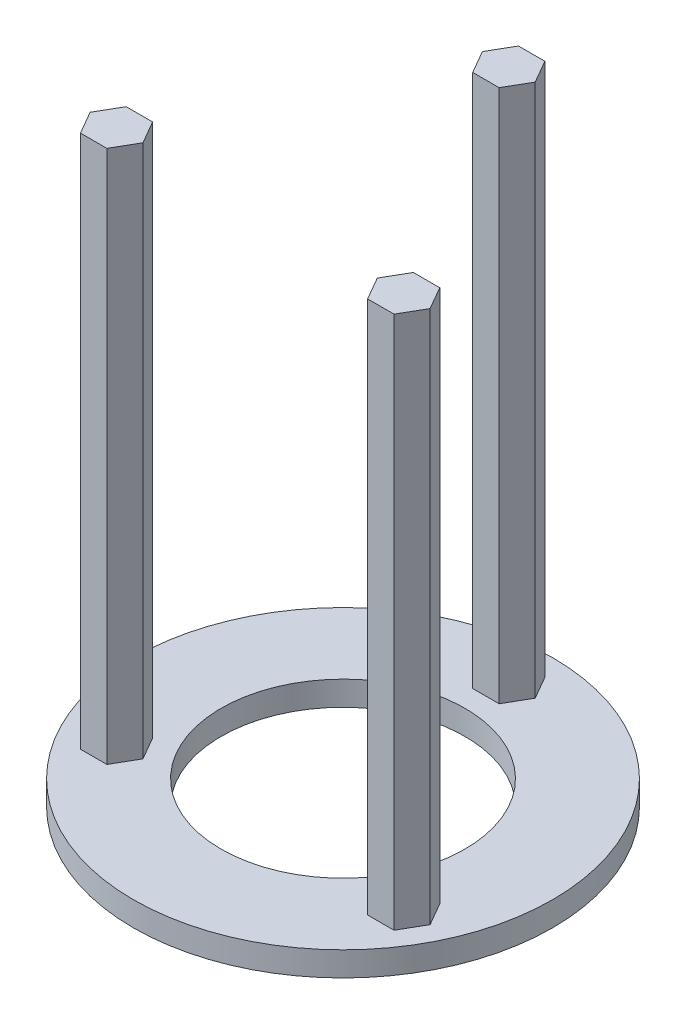
ISO-10303-21;
HEADER;
FILE_DESCRIPTION(('STEP AP214'),'2;1');
FILE_NAME('part.step','',(''),(''),'','','');
FILE_SCHEMA(('AUTOMOTIVE_DESIGN { 1 0 10303 214 1 1 1 1 }'));
ENDSEC;
DATA;
#1=APPLICATION_CONTEXT('core data for automotive mechanical design processes');
#2=APPLICATION_PROTOCOL_DEFINITION('international standard','automotive_design',2000,#1);
#3=PRODUCT_CONTEXT('',#1,'mechanical');
#4=PRODUCT('Part','Part','',(#3));
#5=PRODUCT_RELATED_PRODUCT_CATEGORY('part','',(#4));
#6=PRODUCT_DEFINITION_FORMATION('','',#4);
#7=PRODUCT_DEFINITION_CONTEXT('part definition',#1,'design');
#8=PRODUCT_DEFINITION('design','',#6,#7);
#9=PRODUCT_DEFINITION_SHAPE('','',#8);
#10=(LENGTH_UNIT() NAMED_UNIT(*) SI_UNIT(.MILLI.,.METRE.));
#11=(NAMED_UNIT(*) PLANE_ANGLE_UNIT() SI_UNIT($,.RADIAN.));
#12=(NAMED_UNIT(*) SI_UNIT($,.STERADIAN.) SOLID_ANGLE_UNIT());
#13=UNCERTAINTY_MEASURE_WITH_UNIT(LENGTH_MEASURE(1.E-05),#10,'distance_accuracy_value','');
#14=(GEOMETRIC_REPRESENTATION_CONTEXT(3) GLOBAL_UNCERTAINTY_ASSIGNED_CONTEXT((#13)) GLOBAL_UNIT_ASSIGNED_CONTEXT((#10,
#11,#12)) REPRESENTATION_CONTEXT('',''));
#15=CARTESIAN_POINT('',(0.,0.,0.));
#16=DIRECTION('',(0.,0.,1.));
#17=DIRECTION('',(1.,0.,0.));
#18=AXIS2_PLACEMENT_3D('',#15,#16,#17);
#19=CARTESIAN_POINT('',(0.,3.2,0.));
#20=DIRECTION('',(0.,1.,0.));
#21=DIRECTION('',(0.,0.,1.));
#22=AXIS2_PLACEMENT_3D('',#19,#20,#21);
#23=PLANE('',#22);
#24=CARTESIAN_POINT('',(0.,3.2,0.));
#25=DIRECTION('',(0.,1.,0.));
#26=DIRECTION('',(0.,0.,1.));
#27=AXIS2_PLACEMENT_3D('',#24,#25,#26);
#28=CIRCLE('',#27,27.5);
#29=CARTESIAN_POINT('',(0.,3.2,27.5));
#30=VERTEX_POINT('',#29);
#31=EDGE_CURVE('E11',#30,#30,#28,.T.);
#32=ORIENTED_EDGE('',*,*,#31,.T.);
#33=EDGE_LOOP('',(#32));
#34=FACE_BOUND('',#33,.T.);
#35=CARTESIAN_POINT('',(0.,3.2,0.));
#36=DIRECTION('',(0.,1.,0.));
#37=DIRECTION('',(0.,0.,1.));
#38=AXIS2_PLACEMENT_3D('',#35,#36,#37);
#39=CIRCLE('',#38,16.);
#40=CARTESIAN_POINT('',(0.,3.2,16.));
#41=VERTEX_POINT('',#40);
#42=EDGE_CURVE('E287',#41,#41,#39,.T.);
#43=ORIENTED_EDGE('',*,*,#42,.F.);
#44=EDGE_LOOP('',(#43));
#45=FACE_BOUND('',#44,.T.);
#46=DIRECTION('',(-0.5,0.,-0.866025403784439));
#47=VECTOR('',#46,1.);
#48=CARTESIAN_POINT('',(3.46410161513776,3.2,-21.75));
#49=LINE('',#48,#47);
#50=CARTESIAN_POINT('',(3.46410161513776,3.2,-21.75));
#51=VERTEX_POINT('',#50);
#52=CARTESIAN_POINT('',(1.73205080756888,3.2,-24.75));
#53=VERTEX_POINT('',#52);
#54=EDGE_CURVE('E261',#51,#53,#49,.T.);
#55=ORIENTED_EDGE('',*,*,#54,.F.);
#56=DIRECTION('',(0.5,0.,-0.866025403784439));
#57=VECTOR('',#56,1.);
#58=CARTESIAN_POINT('',(1.73205080756888,3.2,-18.75));
#59=LINE('',#58,#57);
#60=CARTESIAN_POINT('',(1.73205080756888,3.2,-18.75));
#61=VERTEX_POINT('',#60);
#62=EDGE_CURVE('E232',#61,#51,#59,.T.);
#63=ORIENTED_EDGE('',*,*,#62,.F.);
#64=DIRECTION('',(1.,0.,0.));
#65=VECTOR('',#64,1.);
#66=CARTESIAN_POINT('',(-1.73205080756888,3.2,-18.75));
#67=LINE('',#66,#65);
#68=CARTESIAN_POINT('',(-1.73205080756888,3.2,-18.75));
#69=VERTEX_POINT('',#68);
#70=EDGE_CURVE('E248',#69,#61,#67,.T.);
#71=ORIENTED_EDGE('',*,*,#70,.F.);
#72=DIRECTION('',(0.5,0.,0.866025403784439));
#73=VECTOR('',#72,1.);
#74=CARTESIAN_POINT('',(-3.46410161513775,3.2,-21.75));
#75=LINE('',#74,#73);
#76=CARTESIAN_POINT('',(-3.46410161513775,3.2,-21.75));
#77=VERTEX_POINT('',#76);
#78=EDGE_CURVE('E267',#77,#69,#75,.T.);
#79=ORIENTED_EDGE('',*,*,#78,.F.);
#80=DIRECTION('',(-0.5,0.,0.866025403784439));
#81=VECTOR('',#80,1.);
#82=CARTESIAN_POINT('',(-1.73205080756887,3.2,-24.75));
#83=LINE('',#82,#81);
#84=CARTESIAN_POINT('',(-1.73205080756887,3.2,-24.75));
#85=VERTEX_POINT('',#84);
#86=EDGE_CURVE('E265',#85,#77,#83,.T.);
#87=ORIENTED_EDGE('',*,*,#86,.F.);
#88=DIRECTION('',(-1.,0.,0.));
#89=VECTOR('',#88,1.);
#90=CARTESIAN_POINT('',(1.73205080756888,3.2,-24.75));
#91=LINE('',#90,#89);
#92=EDGE_CURVE('E263',#53,#85,#91,.T.);
#93=ORIENTED_EDGE('',*,*,#92,.F.);
#94=EDGE_LOOP('',(#55,#63,#71,#79,#87,#93));
#95=FACE_BOUND('',#94,.T.);
#96=DIRECTION('',(1.,0.,0.));
#97=VECTOR('',#96,1.);
#98=CARTESIAN_POINT('',(17.1040017247438,3.2,13.8749999999992));
#99=LINE('',#98,#97);
#100=CARTESIAN_POINT('',(17.1040017247438,3.2,13.8749999999992));
#101=VERTEX_POINT('',#100);
#102=CARTESIAN_POINT('',(20.5681033398816,3.2,13.8749999999992));
#103=VERTEX_POINT('',#102);
#104=EDGE_CURVE('E227',#101,#103,#99,.T.);
#105=ORIENTED_EDGE('',*,*,#104,.F.);
#106=DIRECTION('',(0.500000000000001,0.,0.866025403784438));
#107=VECTOR('',#106,1.);
#108=CARTESIAN_POINT('',(15.3719509171749,3.2,10.8749999999992));
#109=LINE('',#108,#107);
#110=CARTESIAN_POINT('',(15.3719509171749,3.2,10.8749999999992));
#111=VERTEX_POINT('',#110);
#112=EDGE_CURVE('E229',#111,#101,#109,.T.);
#113=ORIENTED_EDGE('',*,*,#112,.F.);
#114=DIRECTION('',(-0.500000000000002,0.,0.866025403784437));
#115=VECTOR('',#114,1.);
#116=CARTESIAN_POINT('',(17.1040017247438,3.2,7.87499999999923));
#117=LINE('',#116,#115);
#118=CARTESIAN_POINT('',(17.1040017247438,3.2,7.87499999999923));
#119=VERTEX_POINT('',#118);
#120=EDGE_CURVE('E218',#119,#111,#117,.T.);
#121=ORIENTED_EDGE('',*,*,#120,.F.);
#122=DIRECTION('',(-1.,0.,0.));
#123=VECTOR('',#122,1.);
#124=CARTESIAN_POINT('',(20.5681033398816,3.2,7.87499999999923));
#125=LINE('',#124,#123);
#126=CARTESIAN_POINT('',(20.5681033398816,3.2,7.87499999999923));
#127=VERTEX_POINT('',#126);
#128=EDGE_CURVE('E220',#127,#119,#125,.T.);
#129=ORIENTED_EDGE('',*,*,#128,.F.);
#130=DIRECTION('',(-0.5,0.,-0.866025403784438));
#131=VECTOR('',#130,1.);
#132=CARTESIAN_POINT('',(22.3001541474504,3.2,10.8749999999992));
#133=LINE('',#132,#131);
#134=CARTESIAN_POINT('',(22.3001541474504,3.2,10.8749999999992));
#135=VERTEX_POINT('',#134);
#136=EDGE_CURVE('E223',#135,#127,#133,.T.);
#137=ORIENTED_EDGE('',*,*,#136,.F.);
#138=DIRECTION('',(0.5,0.,-0.866025403784439));
#139=VECTOR('',#138,1.);
#140=CARTESIAN_POINT('',(20.5681033398816,3.2,13.8749999999992));
#141=LINE('',#140,#139);
#142=EDGE_CURVE('E225',#103,#135,#141,.T.);
#143=ORIENTED_EDGE('',*,*,#142,.F.);
#144=EDGE_LOOP('',(#105,#113,#121,#129,#137,#143));
#145=FACE_BOUND('',#144,.T.);
#146=DIRECTION('',(-0.5,0.,0.866025403784438));
#147=VECTOR('',#146,1.);
#148=CARTESIAN_POINT('',(-20.5681033398792,3.2,7.87500000000058));
#149=LINE('',#148,#147);
#150=CARTESIAN_POINT('',(-20.5681033398792,3.2,7.87500000000058));
#151=VERTEX_POINT('',#150);
#152=CARTESIAN_POINT('',(-22.3001541474481,3.2,10.8750000000006));
#153=VERTEX_POINT('',#152);
#154=EDGE_CURVE('E186',#151,#153,#149,.T.);
#155=ORIENTED_EDGE('',*,*,#154,.F.);
#156=DIRECTION('',(-1.,0.,0.));
#157=VECTOR('',#156,1.);
#158=CARTESIAN_POINT('',(-17.1040017247414,3.2,7.87500000000058));
#159=LINE('',#158,#157);
#160=CARTESIAN_POINT('',(-17.1040017247414,3.2,7.87500000000058));
#161=VERTEX_POINT('',#160);
#162=EDGE_CURVE('E180',#161,#151,#159,.T.);
#163=ORIENTED_EDGE('',*,*,#162,.F.);
#164=DIRECTION('',(-0.499999999999999,0.,-0.866025403784439));
#165=VECTOR('',#164,1.);
#166=CARTESIAN_POINT('',(-15.3719509171725,3.2,10.8750000000006));
#167=LINE('',#166,#165);
#168=CARTESIAN_POINT('',(-15.3719509171725,3.2,10.8750000000006));
#169=VERTEX_POINT('',#168);
#170=EDGE_CURVE('E165',#169,#161,#167,.T.);
#171=ORIENTED_EDGE('',*,*,#170,.F.);
#172=DIRECTION('',(0.5,0.,-0.866025403784438));
#173=VECTOR('',#172,1.);
#174=CARTESIAN_POINT('',(-17.1040017247414,3.2,13.8750000000006));
#175=LINE('',#174,#173);
#176=CARTESIAN_POINT('',(-17.1040017247414,3.2,13.8750000000006));
#177=VERTEX_POINT('',#176);
#178=EDGE_CURVE('E173',#177,#169,#175,.T.);
#179=ORIENTED_EDGE('',*,*,#178,.F.);
#180=DIRECTION('',(1.,0.,0.));
#181=VECTOR('',#180,1.);
#182=CARTESIAN_POINT('',(-20.5681033398792,3.2,13.8750000000006));
#183=LINE('',#182,#181);
#184=CARTESIAN_POINT('',(-20.5681033398792,3.2,13.8750000000006));
#185=VERTEX_POINT('',#184);
#186=EDGE_CURVE('E637',#185,#177,#183,.T.);
#187=ORIENTED_EDGE('',*,*,#186,.F.);
#188=DIRECTION('',(0.5,0.,0.866025403784439));
#189=VECTOR('',#188,1.);
#190=CARTESIAN_POINT('',(-22.3001541474481,3.2,10.8750000000006));
#191=LINE('',#190,#189);
#192=EDGE_CURVE('E191',#153,#185,#191,.T.);
#193=ORIENTED_EDGE('',*,*,#192,.F.);
#194=EDGE_LOOP('',(#155,#163,#171,#179,#187,#193));
#195=FACE_BOUND('',#194,.T.);
#196=ADVANCED_FACE('F39',(#34,#45,#95,#145,#195),#23,.T.);
#197=CARTESIAN_POINT('',(0.,0.,0.));
#198=DIRECTION('',(0.,1.,0.));
#199=DIRECTION('',(0.,0.,1.));
#200=AXIS2_PLACEMENT_3D('',#197,#198,#199);
#201=PLANE('',#200);
#202=CARTESIAN_POINT('',(0.,0.,0.));
#203=DIRECTION('',(0.,1.,0.));
#204=DIRECTION('',(0.,0.,1.));
#205=AXIS2_PLACEMENT_3D('',#202,#203,#204);
#206=CIRCLE('',#205,27.5);
#207=CARTESIAN_POINT('',(0.,0.,27.5));
#208=VERTEX_POINT('',#207);
#209=EDGE_CURVE('E43',#208,#208,#206,.T.);
#210=ORIENTED_EDGE('',*,*,#209,.F.);
#211=EDGE_LOOP('',(#210));
#212=FACE_BOUND('',#211,.T.);
#213=CARTESIAN_POINT('',(0.,0.,0.));
#214=DIRECTION('',(0.,1.,0.));
#215=DIRECTION('',(0.,0.,1.));
#216=AXIS2_PLACEMENT_3D('',#213,#214,#215);
#217=CIRCLE('',#216,16.);
#218=CARTESIAN_POINT('',(0.,0.,16.));
#219=VERTEX_POINT('',#218);
#220=EDGE_CURVE('E286',#219,#219,#217,.T.);
#221=ORIENTED_EDGE('',*,*,#220,.T.);
#222=EDGE_LOOP('',(#221));
#223=FACE_BOUND('',#222,.T.);
#224=ADVANCED_FACE('F293',(#212,#223),#201,.F.);
#225=CARTESIAN_POINT('',(0.,3.2,0.));
#226=DIRECTION('',(0.,-1.,0.));
#227=DIRECTION('',(0.,0.,-1.));
#228=AXIS2_PLACEMENT_3D('',#225,#226,#227);
#229=CYLINDRICAL_SURFACE('',#228,27.5);
#230=ORIENTED_EDGE('',*,*,#31,.F.);
#231=EDGE_LOOP('',(#230));
#232=FACE_BOUND('',#231,.T.);
#233=ORIENTED_EDGE('',*,*,#209,.T.);
#234=EDGE_LOOP('',(#233));
#235=FACE_BOUND('',#234,.T.);
#236=ADVANCED_FACE('F41',(#232,#235),#229,.T.);
#237=CARTESIAN_POINT('',(0.,3.2,0.));
#238=DIRECTION('',(0.,-1.,0.));
#239=DIRECTION('',(0.,0.,-1.));
#240=AXIS2_PLACEMENT_3D('',#237,#238,#239);
#241=CYLINDRICAL_SURFACE('',#240,16.);
#242=ORIENTED_EDGE('',*,*,#42,.T.);
#243=EDGE_LOOP('',(#242));
#244=FACE_BOUND('',#243,.T.);
#245=ORIENTED_EDGE('',*,*,#220,.F.);
#246=EDGE_LOOP('',(#245));
#247=FACE_BOUND('',#246,.T.);
#248=ADVANCED_FACE('F295',(#244,#247),#241,.F.);
#249=CARTESIAN_POINT('',(1.73205080756888,73.2,-18.75));
#250=DIRECTION('',(-0.866025403784439,0.,-0.5));
#251=DIRECTION('',(-0.5,0.,0.866025403784439));
#252=AXIS2_PLACEMENT_3D('',#249,#250,#251);
#253=PLANE('',#252);
#254=ORIENTED_EDGE('',*,*,#62,.T.);
#255=DIRECTION('',(0.,-1.,0.));
#256=VECTOR('',#255,1.);
#257=CARTESIAN_POINT('',(3.46410161513776,73.2,-21.75));
#258=LINE('',#257,#256);
#259=CARTESIAN_POINT('',(3.46410161513776,73.2,-21.75));
#260=VERTEX_POINT('',#259);
#261=EDGE_CURVE('E284',#260,#51,#258,.T.);
#262=ORIENTED_EDGE('',*,*,#261,.F.);
#263=DIRECTION('',(0.5,0.,-0.866025403784439));
#264=VECTOR('',#263,1.);
#265=CARTESIAN_POINT('',(1.73205080756888,73.2,-18.75));
#266=LINE('',#265,#264);
#267=CARTESIAN_POINT('',(1.73205080756888,73.2,-18.75));
#268=VERTEX_POINT('',#267);
#269=EDGE_CURVE('E244',#268,#260,#266,.T.);
#270=ORIENTED_EDGE('',*,*,#269,.F.);
#271=DIRECTION('',(0.,-1.,0.));
#272=VECTOR('',#271,1.);
#273=CARTESIAN_POINT('',(1.73205080756888,73.2,-18.75));
#274=LINE('',#273,#272);
#275=EDGE_CURVE('E258',#268,#61,#274,.T.);
#276=ORIENTED_EDGE('',*,*,#275,.T.);
#277=EDGE_LOOP('',(#254,#262,#270,#276));
#278=FACE_BOUND('',#277,.T.);
#279=ADVANCED_FACE('F297',(#278),#253,.F.);
#280=CARTESIAN_POINT('',(3.46410161513776,73.2,-21.75));
#281=DIRECTION('',(-0.866025403784439,0.,0.5));
#282=DIRECTION('',(0.5,0.,0.866025403784439));
#283=AXIS2_PLACEMENT_3D('',#280,#281,#282);
#284=PLANE('',#283);
#285=ORIENTED_EDGE('',*,*,#54,.T.);
#286=DIRECTION('',(0.,-1.,0.));
#287=VECTOR('',#286,1.);
#288=CARTESIAN_POINT('',(1.73205080756888,73.2,-24.75));
#289=LINE('',#288,#287);
#290=CARTESIAN_POINT('',(1.73205080756888,73.2,-24.75));
#291=VERTEX_POINT('',#290);
#292=EDGE_CURVE('E281',#291,#53,#289,.T.);
#293=ORIENTED_EDGE('',*,*,#292,.F.);
#294=DIRECTION('',(-0.5,0.,-0.866025403784439));
#295=VECTOR('',#294,1.);
#296=CARTESIAN_POINT('',(3.46410161513776,73.2,-21.75));
#297=LINE('',#296,#295);
#298=EDGE_CURVE('E247',#260,#291,#297,.T.);
#299=ORIENTED_EDGE('',*,*,#298,.F.);
#300=ORIENTED_EDGE('',*,*,#261,.T.);
#301=EDGE_LOOP('',(#285,#293,#299,#300));
#302=FACE_BOUND('',#301,.T.);
#303=ADVANCED_FACE('F304',(#302),#284,.F.);
#304=CARTESIAN_POINT('',(1.73205080756888,73.2,-24.75));
#305=DIRECTION('',(0.,0.,1.));
#306=DIRECTION('',(1.,0.,0.));
#307=AXIS2_PLACEMENT_3D('',#304,#305,#306);
#308=PLANE('',#307);
#309=ORIENTED_EDGE('',*,*,#92,.T.);
#310=DIRECTION('',(0.,-1.,0.));
#311=VECTOR('',#310,1.);
#312=CARTESIAN_POINT('',(-1.73205080756887,73.2,-24.75));
#313=LINE('',#312,#311);
#314=CARTESIAN_POINT('',(-1.73205080756887,73.2,-24.75));
#315=VERTEX_POINT('',#314);
#316=EDGE_CURVE('E278',#315,#85,#313,.T.);
#317=ORIENTED_EDGE('',*,*,#316,.F.);
#318=DIRECTION('',(-1.,0.,0.));
#319=VECTOR('',#318,1.);
#320=CARTESIAN_POINT('',(1.73205080756888,73.2,-24.75));
#321=LINE('',#320,#319);
#322=EDGE_CURVE('E250',#291,#315,#321,.T.);
#323=ORIENTED_EDGE('',*,*,#322,.F.);
#324=ORIENTED_EDGE('',*,*,#292,.T.);
#325=EDGE_LOOP('',(#309,#317,#323,#324));
#326=FACE_BOUND('',#325,.T.);
#327=ADVANCED_FACE('F380',(#326),#308,.F.);
#328=CARTESIAN_POINT('',(-1.73205080756887,73.2,-24.75));
#329=DIRECTION('',(0.866025403784439,0.,0.5));
#330=DIRECTION('',(0.5,0.,-0.866025403784439));
#331=AXIS2_PLACEMENT_3D('',#328,#329,#330);
#332=PLANE('',#331);
#333=ORIENTED_EDGE('',*,*,#86,.T.);
#334=DIRECTION('',(0.,-1.,0.));
#335=VECTOR('',#334,1.);
#336=CARTESIAN_POINT('',(-3.46410161513775,73.2,-21.75));
#337=LINE('',#336,#335);
#338=CARTESIAN_POINT('',(-3.46410161513775,73.2,-21.75));
#339=VERTEX_POINT('',#338);
#340=EDGE_CURVE('E275',#339,#77,#337,.T.);
#341=ORIENTED_EDGE('',*,*,#340,.F.);
#342=DIRECTION('',(-0.5,0.,0.866025403784439));
#343=VECTOR('',#342,1.);
#344=CARTESIAN_POINT('',(-1.73205080756887,73.2,-24.75));
#345=LINE('',#344,#343);
#346=EDGE_CURVE('E252',#315,#339,#345,.T.);
#347=ORIENTED_EDGE('',*,*,#346,.F.);
#348=ORIENTED_EDGE('',*,*,#316,.T.);
#349=EDGE_LOOP('',(#333,#341,#347,#348));
#350=FACE_BOUND('',#349,.T.);
#351=ADVANCED_FACE('F376',(#350),#332,.F.);
#352=CARTESIAN_POINT('',(-3.46410161513775,73.2,-21.75));
#353=DIRECTION('',(0.866025403784439,0.,-0.5));
#354=DIRECTION('',(-0.5,0.,-0.866025403784439));
#355=AXIS2_PLACEMENT_3D('',#352,#353,#354);
#356=PLANE('',#355);
#357=ORIENTED_EDGE('',*,*,#78,.T.);
#358=DIRECTION('',(0.,-1.,0.));
#359=VECTOR('',#358,1.);
#360=CARTESIAN_POINT('',(-1.73205080756888,73.2,-18.75));
#361=LINE('',#360,#359);
#362=CARTESIAN_POINT('',(-1.73205080756888,73.2,-18.75));
#363=VERTEX_POINT('',#362);
#364=EDGE_CURVE('E273',#363,#69,#361,.T.);
#365=ORIENTED_EDGE('',*,*,#364,.F.);
#366=DIRECTION('',(0.5,0.,0.866025403784439));
#367=VECTOR('',#366,1.);
#368=CARTESIAN_POINT('',(-3.46410161513775,73.2,-21.75));
#369=LINE('',#368,#367);
#370=EDGE_CURVE('E254',#339,#363,#369,.T.);
#371=ORIENTED_EDGE('',*,*,#370,.F.);
#372=ORIENTED_EDGE('',*,*,#340,.T.);
#373=EDGE_LOOP('',(#357,#365,#371,#372));
#374=FACE_BOUND('',#373,.T.);
#375=ADVANCED_FACE('F372',(#374),#356,.F.);
#376=CARTESIAN_POINT('',(-1.73205080756888,73.2,-18.75));
#377=DIRECTION('',(0.,0.,-1.));
#378=DIRECTION('',(-1.,0.,0.));
#379=AXIS2_PLACEMENT_3D('',#376,#377,#378);
#380=PLANE('',#379);
#381=ORIENTED_EDGE('',*,*,#70,.T.);
#382=ORIENTED_EDGE('',*,*,#275,.F.);
#383=DIRECTION('',(1.,0.,0.));
#384=VECTOR('',#383,1.);
#385=CARTESIAN_POINT('',(-1.73205080756888,73.2,-18.75));
#386=LINE('',#385,#384);
#387=EDGE_CURVE('E256',#363,#268,#386,.T.);
#388=ORIENTED_EDGE('',*,*,#387,.F.);
#389=ORIENTED_EDGE('',*,*,#364,.T.);
#390=EDGE_LOOP('',(#381,#382,#388,#389));
#391=FACE_BOUND('',#390,.T.);
#392=ADVANCED_FACE('F368',(#391),#380,.F.);
#393=CARTESIAN_POINT('',(0.,73.2,0.));
#394=DIRECTION('',(0.,1.,0.));
#395=DIRECTION('',(0.,0.,1.));
#396=AXIS2_PLACEMENT_3D('',#393,#394,#395);
#397=PLANE('',#396);
#398=ORIENTED_EDGE('',*,*,#269,.T.);
#399=ORIENTED_EDGE('',*,*,#298,.T.);
#400=ORIENTED_EDGE('',*,*,#322,.T.);
#401=ORIENTED_EDGE('',*,*,#346,.T.);
#402=ORIENTED_EDGE('',*,*,#370,.T.);
#403=ORIENTED_EDGE('',*,*,#387,.T.);
#404=EDGE_LOOP('',(#398,#399,#400,#401,#402,#403));
#405=FACE_BOUND('',#404,.T.);
#406=ADVANCED_FACE('F365',(#405),#397,.T.);
#407=CARTESIAN_POINT('',(15.3719509171749,73.2,10.8749999999992));
#408=DIRECTION('',(0.866025403784438,0.,-0.500000000000001));
#409=DIRECTION('',(-0.500000000000001,0.,-0.866025403784438));
#410=AXIS2_PLACEMENT_3D('',#407,#408,#409);
#411=PLANE('',#410);
#412=ORIENTED_EDGE('',*,*,#112,.T.);
#413=DIRECTION('',(0.,-1.,0.));
#414=VECTOR('',#413,1.);
#415=CARTESIAN_POINT('',(17.1040017247438,73.2,13.8749999999992));
#416=LINE('',#415,#414);
#417=CARTESIAN_POINT('',(17.1040017247438,73.2,13.8749999999992));
#418=VERTEX_POINT('',#417);
#419=EDGE_CURVE('E187',#418,#101,#416,.T.);
#420=ORIENTED_EDGE('',*,*,#419,.F.);
#421=DIRECTION('',(0.500000000000001,0.,0.866025403784438));
#422=VECTOR('',#421,1.);
#423=CARTESIAN_POINT('',(15.3719509171749,73.2,10.8749999999992));
#424=LINE('',#423,#422);
#425=CARTESIAN_POINT('',(15.3719509171749,73.2,10.8749999999992));
#426=VERTEX_POINT('',#425);
#427=EDGE_CURVE('E221',#426,#418,#424,.T.);
#428=ORIENTED_EDGE('',*,*,#427,.F.);
#429=DIRECTION('',(0.,-1.,0.));
#430=VECTOR('',#429,1.);
#431=CARTESIAN_POINT('',(15.3719509171749,73.2,10.8749999999992));
#432=LINE('',#431,#430);
#433=EDGE_CURVE('E214',#426,#111,#432,.T.);
#434=ORIENTED_EDGE('',*,*,#433,.T.);
#435=EDGE_LOOP('',(#412,#420,#428,#434));
#436=FACE_BOUND('',#435,.T.);
#437=ADVANCED_FACE('F343',(#436),#411,.F.);
#438=CARTESIAN_POINT('',(17.1040017247438,73.2,13.8749999999992));
#439=DIRECTION('',(0.,0.,-1.));
#440=DIRECTION('',(-1.,0.,0.));
#441=AXIS2_PLACEMENT_3D('',#438,#439,#440);
#442=PLANE('',#441);
#443=ORIENTED_EDGE('',*,*,#104,.T.);
#444=DIRECTION('',(0.,-1.,0.));
#445=VECTOR('',#444,1.);
#446=CARTESIAN_POINT('',(20.5681033398816,73.2,13.8749999999992));
#447=LINE('',#446,#445);
#448=CARTESIAN_POINT('',(20.5681033398816,73.2,13.8749999999992));
#449=VERTEX_POINT('',#448);
#450=EDGE_CURVE('E189',#449,#103,#447,.T.);
#451=ORIENTED_EDGE('',*,*,#450,.F.);
#452=DIRECTION('',(1.,0.,0.));
#453=VECTOR('',#452,1.);
#454=CARTESIAN_POINT('',(17.1040017247438,73.2,13.8749999999992));
#455=LINE('',#454,#453);
#456=EDGE_CURVE('E240',#418,#449,#455,.T.);
#457=ORIENTED_EDGE('',*,*,#456,.F.);
#458=ORIENTED_EDGE('',*,*,#419,.T.);
#459=EDGE_LOOP('',(#443,#451,#457,#458));
#460=FACE_BOUND('',#459,.T.);
#461=ADVANCED_FACE('F330',(#460),#442,.F.);
#462=CARTESIAN_POINT('',(20.5681033398816,73.2,13.8749999999992));
#463=DIRECTION('',(-0.866025403784439,0.,-0.5));
#464=DIRECTION('',(-0.5,0.,0.866025403784439));
#465=AXIS2_PLACEMENT_3D('',#462,#463,#464);
#466=PLANE('',#465);
#467=ORIENTED_EDGE('',*,*,#142,.T.);
#468=DIRECTION('',(0.,-1.,0.));
#469=VECTOR('',#468,1.);
#470=CARTESIAN_POINT('',(22.3001541474504,73.2,10.8749999999992));
#471=LINE('',#470,#469);
#472=CARTESIAN_POINT('',(22.3001541474504,73.2,10.8749999999992));
#473=VERTEX_POINT('',#472);
#474=EDGE_CURVE('E207',#473,#135,#471,.T.);
#475=ORIENTED_EDGE('',*,*,#474,.F.);
#476=DIRECTION('',(0.5,0.,-0.866025403784439));
#477=VECTOR('',#476,1.);
#478=CARTESIAN_POINT('',(20.5681033398816,73.2,13.8749999999992));
#479=LINE('',#478,#477);
#480=EDGE_CURVE('E238',#449,#473,#479,.T.);
#481=ORIENTED_EDGE('',*,*,#480,.F.);
#482=ORIENTED_EDGE('',*,*,#450,.T.);
#483=EDGE_LOOP('',(#467,#475,#481,#482));
#484=FACE_BOUND('',#483,.T.);
#485=ADVANCED_FACE('F334',(#484),#466,.F.);
#486=CARTESIAN_POINT('',(22.3001541474504,73.2,10.8749999999992));
#487=DIRECTION('',(-0.866025403784438,0.,0.5));
#488=DIRECTION('',(0.5,0.,0.866025403784439));
#489=AXIS2_PLACEMENT_3D('',#486,#487,#488);
#490=PLANE('',#489);
#491=ORIENTED_EDGE('',*,*,#136,.T.);
#492=DIRECTION('',(0.,-1.,0.));
#493=VECTOR('',#492,1.);
#494=CARTESIAN_POINT('',(20.5681033398816,73.2,7.87499999999923));
#495=LINE('',#494,#493);
#496=CARTESIAN_POINT('',(20.5681033398816,73.2,7.87499999999923));
#497=VERTEX_POINT('',#496);
#498=EDGE_CURVE('E210',#497,#127,#495,.T.);
#499=ORIENTED_EDGE('',*,*,#498,.F.);
#500=DIRECTION('',(-0.5,0.,-0.866025403784438));
#501=VECTOR('',#500,1.);
#502=CARTESIAN_POINT('',(22.3001541474504,73.2,10.8749999999992));
#503=LINE('',#502,#501);
#504=EDGE_CURVE('E236',#473,#497,#503,.T.);
#505=ORIENTED_EDGE('',*,*,#504,.F.);
#506=ORIENTED_EDGE('',*,*,#474,.T.);
#507=EDGE_LOOP('',(#491,#499,#505,#506));
#508=FACE_BOUND('',#507,.T.);
#509=ADVANCED_FACE('F350',(#508),#490,.F.);
#510=CARTESIAN_POINT('',(20.5681033398816,73.2,7.87499999999923));
#511=DIRECTION('',(0.,0.,1.));
#512=DIRECTION('',(1.,0.,0.));
#513=AXIS2_PLACEMENT_3D('',#510,#511,#512);
#514=PLANE('',#513);
#515=ORIENTED_EDGE('',*,*,#128,.T.);
#516=DIRECTION('',(0.,-1.,0.));
#517=VECTOR('',#516,1.);
#518=CARTESIAN_POINT('',(17.1040017247438,73.2,7.87499999999923));
#519=LINE('',#518,#517);
#520=CARTESIAN_POINT('',(17.1040017247438,73.2,7.87499999999923));
#521=VERTEX_POINT('',#520);
#522=EDGE_CURVE('E62',#521,#119,#519,.T.);
#523=ORIENTED_EDGE('',*,*,#522,.F.);
#524=DIRECTION('',(-1.,0.,0.));
#525=VECTOR('',#524,1.);
#526=CARTESIAN_POINT('',(20.5681033398816,73.2,7.87499999999923));
#527=LINE('',#526,#525);
#528=EDGE_CURVE('E234',#497,#521,#527,.T.);
#529=ORIENTED_EDGE('',*,*,#528,.F.);
#530=ORIENTED_EDGE('',*,*,#498,.T.);
#531=EDGE_LOOP('',(#515,#523,#529,#530));
#532=FACE_BOUND('',#531,.T.);
#533=ADVANCED_FACE('F347',(#532),#514,.F.);
#534=CARTESIAN_POINT('',(17.1040017247438,73.2,7.87499999999923));
#535=DIRECTION('',(0.866025403784437,0.,0.500000000000002));
#536=DIRECTION('',(0.500000000000002,0.,-0.866025403784437));
#537=AXIS2_PLACEMENT_3D('',#534,#535,#536);
#538=PLANE('',#537);
#539=ORIENTED_EDGE('',*,*,#120,.T.);
#540=ORIENTED_EDGE('',*,*,#433,.F.);
#541=DIRECTION('',(-0.500000000000002,0.,0.866025403784437));
#542=VECTOR('',#541,1.);
#543=CARTESIAN_POINT('',(17.1040017247438,73.2,7.87499999999923));
#544=LINE('',#543,#542);
#545=EDGE_CURVE('E217',#521,#426,#544,.T.);
#546=ORIENTED_EDGE('',*,*,#545,.F.);
#547=ORIENTED_EDGE('',*,*,#522,.T.);
#548=EDGE_LOOP('',(#539,#540,#546,#547));
#549=FACE_BOUND('',#548,.T.);
#550=ADVANCED_FACE('F344',(#549),#538,.F.);
#551=CARTESIAN_POINT('',(0.,73.2,0.));
#552=DIRECTION('',(0.,1.,0.));
#553=DIRECTION('',(0.,0.,1.));
#554=AXIS2_PLACEMENT_3D('',#551,#552,#553);
#555=PLANE('',#554);
#556=ORIENTED_EDGE('',*,*,#427,.T.);
#557=ORIENTED_EDGE('',*,*,#456,.T.);
#558=ORIENTED_EDGE('',*,*,#480,.T.);
#559=ORIENTED_EDGE('',*,*,#504,.T.);
#560=ORIENTED_EDGE('',*,*,#528,.T.);
#561=ORIENTED_EDGE('',*,*,#545,.T.);
#562=EDGE_LOOP('',(#556,#557,#558,#559,#560,#561));
#563=FACE_BOUND('',#562,.T.);
#564=ADVANCED_FACE('F338',(#563),#555,.T.);
#565=CARTESIAN_POINT('',(-17.1040017247414,73.2,7.87500000000058));
#566=DIRECTION('',(0.,0.,1.));
#567=DIRECTION('',(1.,0.,0.));
#568=AXIS2_PLACEMENT_3D('',#565,#566,#567);
#569=PLANE('',#568);
#570=ORIENTED_EDGE('',*,*,#162,.T.);
#571=DIRECTION('',(0.,-1.,0.));
#572=VECTOR('',#571,1.);
#573=CARTESIAN_POINT('',(-20.5681033398792,73.2,7.87500000000058));
#574=LINE('',#573,#572);
#575=CARTESIAN_POINT('',(-20.5681033398792,73.2,7.87500000000058));
#576=VERTEX_POINT('',#575);
#577=EDGE_CURVE('E623',#576,#151,#574,.T.);
#578=ORIENTED_EDGE('',*,*,#577,.F.);
#579=DIRECTION('',(-1.,0.,0.));
#580=VECTOR('',#579,1.);
#581=CARTESIAN_POINT('',(-17.1040017247414,73.2,7.87500000000058));
#582=LINE('',#581,#580);
#583=CARTESIAN_POINT('',(-17.1040017247414,73.2,7.87500000000058));
#584=VERTEX_POINT('',#583);
#585=EDGE_CURVE('E174',#584,#576,#582,.T.);
#586=ORIENTED_EDGE('',*,*,#585,.F.);
#587=DIRECTION('',(0.,-1.,0.));
#588=VECTOR('',#587,1.);
#589=CARTESIAN_POINT('',(-17.1040017247414,73.2,7.87500000000058));
#590=LINE('',#589,#588);
#591=EDGE_CURVE('E168',#584,#161,#590,.T.);
#592=ORIENTED_EDGE('',*,*,#591,.T.);
#593=EDGE_LOOP('',(#570,#578,#586,#592));
#594=FACE_BOUND('',#593,.T.);
#595=ADVANCED_FACE('F178',(#594),#569,.F.);
#596=CARTESIAN_POINT('',(-20.5681033398792,73.2,7.87500000000058));
#597=DIRECTION('',(0.866025403784439,0.,0.5));
#598=DIRECTION('',(0.5,0.,-0.866025403784439));
#599=AXIS2_PLACEMENT_3D('',#596,#597,#598);
#600=PLANE('',#599);
#601=ORIENTED_EDGE('',*,*,#154,.T.);
#602=DIRECTION('',(0.,-1.,0.));
#603=VECTOR('',#602,1.);
#604=CARTESIAN_POINT('',(-22.3001541474481,73.2,10.8750000000006));
#605=LINE('',#604,#603);
#606=CARTESIAN_POINT('',(-22.3001541474481,73.2,10.8750000000006));
#607=VERTEX_POINT('',#606);
#608=EDGE_CURVE('E624',#607,#153,#605,.T.);
#609=ORIENTED_EDGE('',*,*,#608,.F.);
#610=DIRECTION('',(-0.5,0.,0.866025403784438));
#611=VECTOR('',#610,1.);
#612=CARTESIAN_POINT('',(-20.5681033398792,73.2,7.87500000000058));
#613=LINE('',#612,#611);
#614=EDGE_CURVE('E202',#576,#607,#613,.T.);
#615=ORIENTED_EDGE('',*,*,#614,.F.);
#616=ORIENTED_EDGE('',*,*,#577,.T.);
#617=EDGE_LOOP('',(#601,#609,#615,#616));
#618=FACE_BOUND('',#617,.T.);
#619=ADVANCED_FACE('F476',(#618),#600,.F.);
#620=CARTESIAN_POINT('',(-22.3001541474481,73.2,10.8750000000006));
#621=DIRECTION('',(0.866025403784439,0.,-0.5));
#622=DIRECTION('',(-0.5,0.,-0.866025403784439));
#623=AXIS2_PLACEMENT_3D('',#620,#621,#622);
#624=PLANE('',#623);
#625=ORIENTED_EDGE('',*,*,#192,.T.);
#626=DIRECTION('',(0.,-1.,0.));
#627=VECTOR('',#626,1.);
#628=CARTESIAN_POINT('',(-20.5681033398792,73.2,13.8750000000006));
#629=LINE('',#628,#627);
#630=CARTESIAN_POINT('',(-20.5681033398792,73.2,13.8750000000006));
#631=VERTEX_POINT('',#630);
#632=EDGE_CURVE('E627',#631,#185,#629,.T.);
#633=ORIENTED_EDGE('',*,*,#632,.F.);
#634=DIRECTION('',(0.5,0.,0.866025403784439));
#635=VECTOR('',#634,1.);
#636=CARTESIAN_POINT('',(-22.3001541474481,73.2,10.8750000000006));
#637=LINE('',#636,#635);
#638=EDGE_CURVE('E200',#607,#631,#637,.T.);
#639=ORIENTED_EDGE('',*,*,#638,.F.);
#640=ORIENTED_EDGE('',*,*,#608,.T.);
#641=EDGE_LOOP('',(#625,#633,#639,#640));
#642=FACE_BOUND('',#641,.T.);
#643=ADVANCED_FACE('F486',(#642),#624,.F.);
#644=CARTESIAN_POINT('',(-20.5681033398792,73.2,13.8750000000006));
#645=DIRECTION('',(0.,0.,-1.));
#646=DIRECTION('',(-1.,0.,0.));
#647=AXIS2_PLACEMENT_3D('',#644,#645,#646);
#648=PLANE('',#647);
#649=ORIENTED_EDGE('',*,*,#186,.T.);
#650=DIRECTION('',(0.,-1.,0.));
#651=VECTOR('',#650,1.);
#652=CARTESIAN_POINT('',(-17.1040017247414,73.2,13.8750000000006));
#653=LINE('',#652,#651);
#654=CARTESIAN_POINT('',(-17.1040017247414,73.2,13.8750000000006));
#655=VERTEX_POINT('',#654);
#656=EDGE_CURVE('E632',#655,#177,#653,.T.);
#657=ORIENTED_EDGE('',*,*,#656,.F.);
#658=DIRECTION('',(1.,0.,0.));
#659=VECTOR('',#658,1.);
#660=CARTESIAN_POINT('',(-20.5681033398792,73.2,13.8750000000006));
#661=LINE('',#660,#659);
#662=EDGE_CURVE('E198',#631,#655,#661,.T.);
#663=ORIENTED_EDGE('',*,*,#662,.F.);
#664=ORIENTED_EDGE('',*,*,#632,.T.);
#665=EDGE_LOOP('',(#649,#657,#663,#664));
#666=FACE_BOUND('',#665,.T.);
#667=ADVANCED_FACE('F497',(#666),#648,.F.);
#668=CARTESIAN_POINT('',(-17.1040017247414,73.2,13.8750000000006));
#669=DIRECTION('',(-0.866025403784438,0.,-0.5));
#670=DIRECTION('',(-0.5,0.,0.866025403784439));
#671=AXIS2_PLACEMENT_3D('',#668,#669,#670);
#672=PLANE('',#671);
#673=ORIENTED_EDGE('',*,*,#178,.T.);
#674=DIRECTION('',(0.,-1.,0.));
#675=VECTOR('',#674,1.);
#676=CARTESIAN_POINT('',(-15.3719509171725,73.2,10.8750000000006));
#677=LINE('',#676,#675);
#678=CARTESIAN_POINT('',(-15.3719509171725,73.2,10.8750000000006));
#679=VERTEX_POINT('',#678);
#680=EDGE_CURVE('E54',#679,#169,#677,.T.);
#681=ORIENTED_EDGE('',*,*,#680,.F.);
#682=DIRECTION('',(0.5,0.,-0.866025403784438));
#683=VECTOR('',#682,1.);
#684=CARTESIAN_POINT('',(-17.1040017247414,73.2,13.8750000000006));
#685=LINE('',#684,#683);
#686=EDGE_CURVE('E196',#655,#679,#685,.T.);
#687=ORIENTED_EDGE('',*,*,#686,.F.);
#688=ORIENTED_EDGE('',*,*,#656,.T.);
#689=EDGE_LOOP('',(#673,#681,#687,#688));
#690=FACE_BOUND('',#689,.T.);
#691=ADVANCED_FACE('F508',(#690),#672,.F.);
#692=CARTESIAN_POINT('',(-15.3719509171725,73.2,10.8750000000006));
#693=DIRECTION('',(-0.866025403784439,0.,0.499999999999999));
#694=DIRECTION('',(0.499999999999999,0.,0.866025403784439));
#695=AXIS2_PLACEMENT_3D('',#692,#693,#694);
#696=PLANE('',#695);
#697=ORIENTED_EDGE('',*,*,#170,.T.);
#698=ORIENTED_EDGE('',*,*,#591,.F.);
#699=DIRECTION('',(-0.499999999999999,0.,-0.866025403784439));
#700=VECTOR('',#699,1.);
#701=CARTESIAN_POINT('',(-15.3719509171725,73.2,10.8750000000006));
#702=LINE('',#701,#700);
#703=EDGE_CURVE('E183',#679,#584,#702,.T.);
#704=ORIENTED_EDGE('',*,*,#703,.F.);
#705=ORIENTED_EDGE('',*,*,#680,.T.);
#706=EDGE_LOOP('',(#697,#698,#704,#705));
#707=FACE_BOUND('',#706,.T.);
#708=ADVANCED_FACE('F167',(#707),#696,.F.);
#709=CARTESIAN_POINT('',(0.,73.2,0.));
#710=DIRECTION('',(0.,1.,0.));
#711=DIRECTION('',(0.,0.,1.));
#712=AXIS2_PLACEMENT_3D('',#709,#710,#711);
#713=PLANE('',#712);
#714=ORIENTED_EDGE('',*,*,#585,.T.);
#715=ORIENTED_EDGE('',*,*,#614,.T.);
#716=ORIENTED_EDGE('',*,*,#638,.T.);
#717=ORIENTED_EDGE('',*,*,#662,.T.);
#718=ORIENTED_EDGE('',*,*,#686,.T.);
#719=ORIENTED_EDGE('',*,*,#703,.T.);
#720=EDGE_LOOP('',(#714,#715,#716,#717,#718,#719));
#721=FACE_BOUND('',#720,.T.);
#722=ADVANCED_FACE('F529',(#721),#713,.T.);
#723=CLOSED_SHELL('',(#196,#224,#236,#248,#279,#303,#327,#351,#375,#392,#406,#437,#461,#485,
#509,#533,#550,#564,#595,#619,#643,#667,#691,#708,#722));
#724=MANIFOLD_SOLID_BREP('B2',#723);
#725=ADVANCED_BREP_SHAPE_REPRESENTATION('',(#18,#724),#14);
#726=SHAPE_DEFINITION_REPRESENTATION(#9,#725);
ENDSEC;
END-ISO-10303-21;
